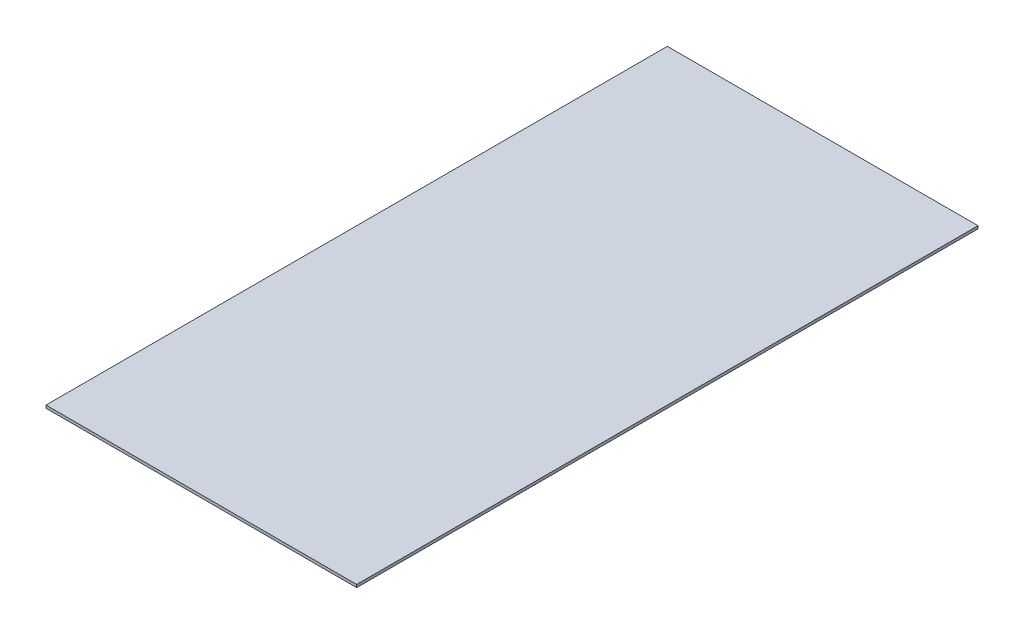
ISO-10303-21;
HEADER;
FILE_DESCRIPTION(('STEP AP214'),'2;1');
FILE_NAME('part.step','',(''),(''),'','','');
FILE_SCHEMA(('AUTOMOTIVE_DESIGN { 1 0 10303 214 1 1 1 1 }'));
ENDSEC;
DATA;
#1=APPLICATION_CONTEXT('core data for automotive mechanical design processes');
#2=APPLICATION_PROTOCOL_DEFINITION('international standard','automotive_design',2000,#1);
#3=PRODUCT_CONTEXT('',#1,'mechanical');
#4=PRODUCT('Part','Part','',(#3));
#5=PRODUCT_RELATED_PRODUCT_CATEGORY('part','',(#4));
#6=PRODUCT_DEFINITION_FORMATION('','',#4);
#7=PRODUCT_DEFINITION_CONTEXT('part definition',#1,'design');
#8=PRODUCT_DEFINITION('design','',#6,#7);
#9=PRODUCT_DEFINITION_SHAPE('','',#8);
#10=(LENGTH_UNIT() NAMED_UNIT(*) SI_UNIT(.MILLI.,.METRE.));
#11=(NAMED_UNIT(*) PLANE_ANGLE_UNIT() SI_UNIT($,.RADIAN.));
#12=(NAMED_UNIT(*) SI_UNIT($,.STERADIAN.) SOLID_ANGLE_UNIT());
#13=UNCERTAINTY_MEASURE_WITH_UNIT(LENGTH_MEASURE(1.E-05),#10,'distance_accuracy_value','');
#14=(GEOMETRIC_REPRESENTATION_CONTEXT(3) GLOBAL_UNCERTAINTY_ASSIGNED_CONTEXT((#13)) GLOBAL_UNIT_ASSIGNED_CONTEXT((#10,
#11,#12)) REPRESENTATION_CONTEXT('',''));
#15=CARTESIAN_POINT('',(0.,0.,0.));
#16=DIRECTION('',(0.,0.,1.));
#17=DIRECTION('',(1.,0.,0.));
#18=AXIS2_PLACEMENT_3D('',#15,#16,#17);
#19=CARTESIAN_POINT('',(-610.,11.,1220.));
#20=DIRECTION('',(0.,0.,-1.));
#21=DIRECTION('',(-1.,0.,0.));
#22=AXIS2_PLACEMENT_3D('',#19,#20,#21);
#23=PLANE('',#22);
#24=DIRECTION('',(1.,0.,0.));
#25=VECTOR('',#24,1.);
#26=CARTESIAN_POINT('',(-610.,0.,1220.));
#27=LINE('',#26,#25);
#28=CARTESIAN_POINT('',(-610.,0.,1220.));
#29=VERTEX_POINT('',#28);
#30=CARTESIAN_POINT('',(610.,0.,1220.));
#31=VERTEX_POINT('',#30);
#32=EDGE_CURVE('E94',#29,#31,#27,.T.);
#33=ORIENTED_EDGE('',*,*,#32,.T.);
#34=DIRECTION('',(0.,-1.,0.));
#35=VECTOR('',#34,1.);
#36=CARTESIAN_POINT('',(610.,11.,1220.));
#37=LINE('',#36,#35);
#38=CARTESIAN_POINT('',(610.,11.,1220.));
#39=VERTEX_POINT('',#38);
#40=EDGE_CURVE('E11',#39,#31,#37,.T.);
#41=ORIENTED_EDGE('',*,*,#40,.F.);
#42=DIRECTION('',(1.,0.,0.));
#43=VECTOR('',#42,1.);
#44=CARTESIAN_POINT('',(-610.,11.,1220.));
#45=LINE('',#44,#43);
#46=CARTESIAN_POINT('',(-610.,11.,1220.));
#47=VERTEX_POINT('',#46);
#48=EDGE_CURVE('E71',#47,#39,#45,.T.);
#49=ORIENTED_EDGE('',*,*,#48,.F.);
#50=DIRECTION('',(0.,-1.,0.));
#51=VECTOR('',#50,1.);
#52=CARTESIAN_POINT('',(-610.,11.,1220.));
#53=LINE('',#52,#51);
#54=EDGE_CURVE('E90',#47,#29,#53,.T.);
#55=ORIENTED_EDGE('',*,*,#54,.T.);
#56=EDGE_LOOP('',(#33,#41,#49,#55));
#57=FACE_BOUND('',#56,.T.);
#58=ADVANCED_FACE('F32',(#57),#23,.F.);
#59=CARTESIAN_POINT('',(610.,11.,-1220.));
#60=DIRECTION('',(1.,0.,0.));
#61=DIRECTION('',(0.,0.,-1.));
#62=AXIS2_PLACEMENT_3D('',#59,#60,#61);
#63=PLANE('',#62);
#64=DIRECTION('',(0.,0.,1.));
#65=VECTOR('',#64,1.);
#66=CARTESIAN_POINT('',(610.,0.,-1220.));
#67=LINE('',#66,#65);
#68=CARTESIAN_POINT('',(610.,0.,-1220.));
#69=VERTEX_POINT('',#68);
#70=EDGE_CURVE('E80',#69,#31,#67,.T.);
#71=ORIENTED_EDGE('',*,*,#70,.F.);
#72=DIRECTION('',(0.,-1.,0.));
#73=VECTOR('',#72,1.);
#74=CARTESIAN_POINT('',(610.,11.,-1220.));
#75=LINE('',#74,#73);
#76=CARTESIAN_POINT('',(610.,11.,-1220.));
#77=VERTEX_POINT('',#76);
#78=EDGE_CURVE('E40',#77,#69,#75,.T.);
#79=ORIENTED_EDGE('',*,*,#78,.F.);
#80=DIRECTION('',(0.,0.,1.));
#81=VECTOR('',#80,1.);
#82=CARTESIAN_POINT('',(610.,11.,-1220.));
#83=LINE('',#82,#81);
#84=EDGE_CURVE('E78',#77,#39,#83,.T.);
#85=ORIENTED_EDGE('',*,*,#84,.T.);
#86=ORIENTED_EDGE('',*,*,#40,.T.);
#87=EDGE_LOOP('',(#71,#79,#85,#86));
#88=FACE_BOUND('',#87,.T.);
#89=ADVANCED_FACE('F77',(#88),#63,.T.);
#90=CARTESIAN_POINT('',(-610.,11.,-1220.));
#91=DIRECTION('',(0.,0.,-1.));
#92=DIRECTION('',(-1.,0.,0.));
#93=AXIS2_PLACEMENT_3D('',#90,#91,#92);
#94=PLANE('',#93);
#95=DIRECTION('',(1.,0.,0.));
#96=VECTOR('',#95,1.);
#97=CARTESIAN_POINT('',(-610.,0.,-1220.));
#98=LINE('',#97,#96);
#99=CARTESIAN_POINT('',(-610.,0.,-1220.));
#100=VERTEX_POINT('',#99);
#101=EDGE_CURVE('E98',#100,#69,#98,.T.);
#102=ORIENTED_EDGE('',*,*,#101,.F.);
#103=DIRECTION('',(0.,-1.,0.));
#104=VECTOR('',#103,1.);
#105=CARTESIAN_POINT('',(-610.,11.,-1220.));
#106=LINE('',#105,#104);
#107=CARTESIAN_POINT('',(-610.,11.,-1220.));
#108=VERTEX_POINT('',#107);
#109=EDGE_CURVE('E63',#108,#100,#106,.T.);
#110=ORIENTED_EDGE('',*,*,#109,.F.);
#111=DIRECTION('',(1.,0.,0.));
#112=VECTOR('',#111,1.);
#113=CARTESIAN_POINT('',(-610.,11.,-1220.));
#114=LINE('',#113,#112);
#115=EDGE_CURVE('E86',#108,#77,#114,.T.);
#116=ORIENTED_EDGE('',*,*,#115,.T.);
#117=ORIENTED_EDGE('',*,*,#78,.T.);
#118=EDGE_LOOP('',(#102,#110,#116,#117));
#119=FACE_BOUND('',#118,.T.);
#120=ADVANCED_FACE('F88',(#119),#94,.T.);
#121=CARTESIAN_POINT('',(-610.,11.,-1220.));
#122=DIRECTION('',(1.,0.,0.));
#123=DIRECTION('',(0.,0.,-1.));
#124=AXIS2_PLACEMENT_3D('',#121,#122,#123);
#125=PLANE('',#124);
#126=DIRECTION('',(0.,0.,1.));
#127=VECTOR('',#126,1.);
#128=CARTESIAN_POINT('',(-610.,0.,-1220.));
#129=LINE('',#128,#127);
#130=EDGE_CURVE('E66',#100,#29,#129,.T.);
#131=ORIENTED_EDGE('',*,*,#130,.T.);
#132=ORIENTED_EDGE('',*,*,#54,.F.);
#133=DIRECTION('',(0.,0.,1.));
#134=VECTOR('',#133,1.);
#135=CARTESIAN_POINT('',(-610.,11.,-1220.));
#136=LINE('',#135,#134);
#137=EDGE_CURVE('E48',#108,#47,#136,.T.);
#138=ORIENTED_EDGE('',*,*,#137,.F.);
#139=ORIENTED_EDGE('',*,*,#109,.T.);
#140=EDGE_LOOP('',(#131,#132,#138,#139));
#141=FACE_BOUND('',#140,.T.);
#142=ADVANCED_FACE('F111',(#141),#125,.F.);
#143=CARTESIAN_POINT('',(0.,11.,0.));
#144=DIRECTION('',(0.,-1.,0.));
#145=DIRECTION('',(0.,0.,-1.));
#146=AXIS2_PLACEMENT_3D('',#143,#144,#145);
#147=PLANE('',#146);
#148=ORIENTED_EDGE('',*,*,#48,.T.);
#149=ORIENTED_EDGE('',*,*,#84,.F.);
#150=ORIENTED_EDGE('',*,*,#115,.F.);
#151=ORIENTED_EDGE('',*,*,#137,.T.);
#152=EDGE_LOOP('',(#148,#149,#150,#151));
#153=FACE_BOUND('',#152,.T.);
#154=ADVANCED_FACE('F85',(#153),#147,.F.);
#155=CARTESIAN_POINT('',(0.,0.,0.));
#156=DIRECTION('',(0.,-1.,0.));
#157=DIRECTION('',(0.,0.,-1.));
#158=AXIS2_PLACEMENT_3D('',#155,#156,#157);
#159=PLANE('',#158);
#160=ORIENTED_EDGE('',*,*,#32,.F.);
#161=ORIENTED_EDGE('',*,*,#130,.F.);
#162=ORIENTED_EDGE('',*,*,#101,.T.);
#163=ORIENTED_EDGE('',*,*,#70,.T.);
#164=EDGE_LOOP('',(#160,#161,#162,#163));
#165=FACE_BOUND('',#164,.T.);
#166=ADVANCED_FACE('F105',(#165),#159,.T.);
#167=CLOSED_SHELL('',(#58,#89,#120,#142,#154,#166));
#168=MANIFOLD_SOLID_BREP('B2',#167);
#169=ADVANCED_BREP_SHAPE_REPRESENTATION('',(#18,#168),#14);
#170=SHAPE_DEFINITION_REPRESENTATION(#9,#169);
ENDSEC;
END-ISO-10303-21;
